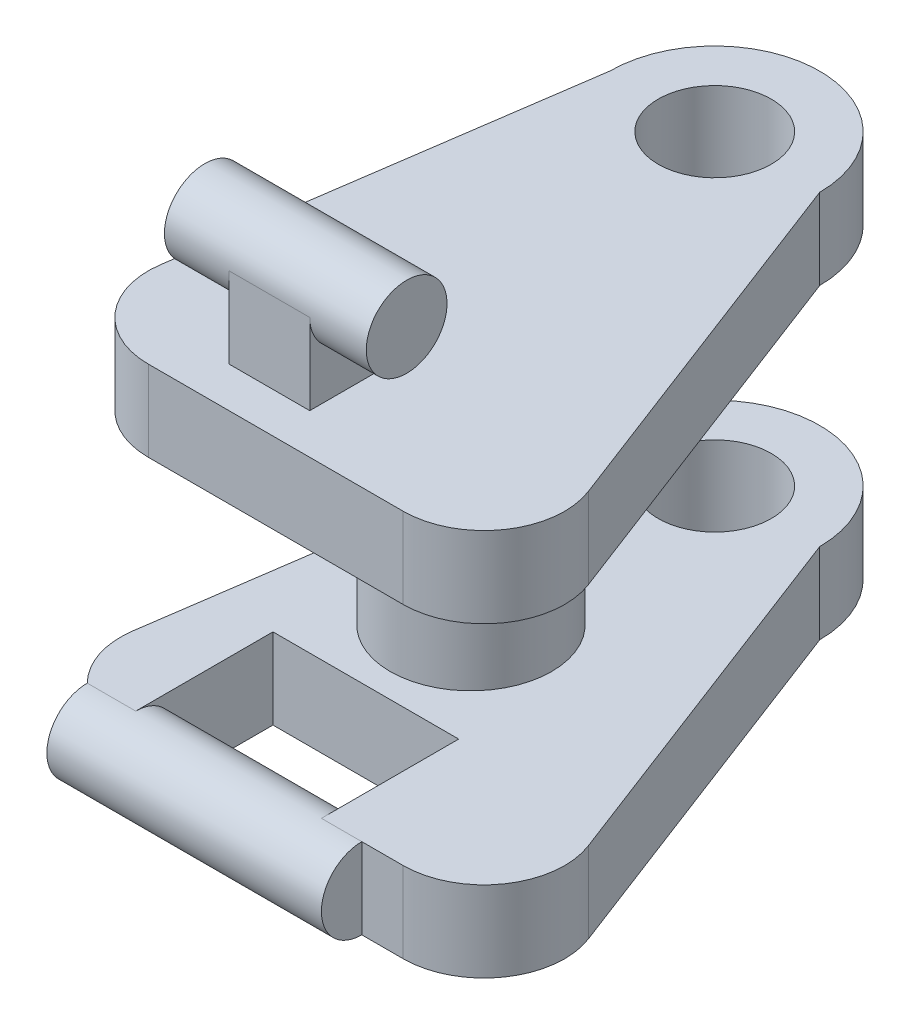
ISO-10303-21;
HEADER;
FILE_DESCRIPTION(('STEP AP214'),'2;1');
FILE_NAME('part.step','',(''),(''),'','','');
FILE_SCHEMA(('AUTOMOTIVE_DESIGN { 1 0 10303 214 1 1 1 1 }'));
ENDSEC;
DATA;
#1=APPLICATION_CONTEXT('core data for automotive mechanical design processes');
#2=APPLICATION_PROTOCOL_DEFINITION('international standard','automotive_design',2000,#1);
#3=PRODUCT_CONTEXT('',#1,'mechanical');
#4=PRODUCT('Part','Part','',(#3));
#5=PRODUCT_RELATED_PRODUCT_CATEGORY('part','',(#4));
#6=PRODUCT_DEFINITION_FORMATION('','',#4);
#7=PRODUCT_DEFINITION_CONTEXT('part definition',#1,'design');
#8=PRODUCT_DEFINITION('design','',#6,#7);
#9=PRODUCT_DEFINITION_SHAPE('','',#8);
#10=(LENGTH_UNIT() NAMED_UNIT(*) SI_UNIT(.MILLI.,.METRE.));
#11=(NAMED_UNIT(*) PLANE_ANGLE_UNIT() SI_UNIT($,.RADIAN.));
#12=(NAMED_UNIT(*) SI_UNIT($,.STERADIAN.) SOLID_ANGLE_UNIT());
#13=UNCERTAINTY_MEASURE_WITH_UNIT(LENGTH_MEASURE(1.E-05),#10,'distance_accuracy_value','');
#14=(GEOMETRIC_REPRESENTATION_CONTEXT(3) GLOBAL_UNCERTAINTY_ASSIGNED_CONTEXT((#13)) GLOBAL_UNIT_ASSIGNED_CONTEXT((#10,
#11,#12)) REPRESENTATION_CONTEXT('',''));
#15=CARTESIAN_POINT('',(0.,0.,0.));
#16=DIRECTION('',(0.,0.,1.));
#17=DIRECTION('',(1.,0.,0.));
#18=AXIS2_PLACEMENT_3D('',#15,#16,#17);
#19=CARTESIAN_POINT('',(0.,10.,0.));
#20=DIRECTION('',(0.,1.,0.));
#21=DIRECTION('',(0.,0.,1.));
#22=AXIS2_PLACEMENT_3D('',#19,#20,#21);
#23=PLANE('',#22);
#24=DIRECTION('',(1.,0.,0.));
#25=VECTOR('',#24,1.);
#26=CARTESIAN_POINT('',(0.,10.,0.));
#27=LINE('',#26,#25);
#28=CARTESIAN_POINT('',(6.09364936911274,10.,0.));
#29=VERTEX_POINT('',#28);
#30=CARTESIAN_POINT('',(37.6709794983246,10.,0.));
#31=VERTEX_POINT('',#30);
#32=EDGE_CURVE('E317',#29,#31,#27,.T.);
#33=ORIENTED_EDGE('',*,*,#32,.T.);
#34=CARTESIAN_POINT('',(37.6709794983246,10.,-10.));
#35=DIRECTION('',(0.,1.,0.));
#36=DIRECTION('',(0.,0.,1.));
#37=AXIS2_PLACEMENT_3D('',#34,#35,#36);
#38=CIRCLE('',#37,10.);
#39=CARTESIAN_POINT('',(47.0107100608177,10.,-13.5734343452809));
#40=VERTEX_POINT('',#39);
#41=EDGE_CURVE('E357',#31,#40,#38,.T.);
#42=ORIENTED_EDGE('',*,*,#41,.T.);
#43=DIRECTION('',(0.357343434528091,0.,0.933973056249305));
#44=VECTOR('',#43,1.);
#45=CARTESIAN_POINT('',(45.5378309625569,10.,-17.4230346456334));
#46=LINE('',#45,#44);
#47=CARTESIAN_POINT('',(29.2476404375621,10.,-60.));
#48=VERTEX_POINT('',#47);
#49=EDGE_CURVE('E308',#48,#40,#46,.T.);
#50=ORIENTED_EDGE('',*,*,#49,.F.);
#51=CARTESIAN_POINT('',(16.2476404375621,10.,-60.));
#52=DIRECTION('',(0.,1.,0.));
#53=DIRECTION('',(0.,0.,1.));
#54=AXIS2_PLACEMENT_3D('',#51,#52,#53);
#55=CIRCLE('',#54,13.);
#56=CARTESIAN_POINT('',(3.24764043756206,10.,-60.));
#57=VERTEX_POINT('',#56);
#58=EDGE_CURVE('E311',#48,#57,#55,.T.);
#59=ORIENTED_EDGE('',*,*,#58,.T.);
#60=DIRECTION('',(-0.143670333869138,0.,0.989625603531927));
#61=VECTOR('',#60,1.);
#62=CARTESIAN_POINT('',(-5.3501850959242,10.,-0.776720889445257));
#63=LINE('',#62,#61);
#64=CARTESIAN_POINT('',(-3.80260666620653,10.,-11.4367033386914));
#65=VERTEX_POINT('',#64);
#66=EDGE_CURVE('E314',#57,#65,#63,.T.);
#67=ORIENTED_EDGE('',*,*,#66,.T.);
#68=CARTESIAN_POINT('',(6.09364936911274,10.,-10.));
#69=DIRECTION('',(0.,1.,0.));
#70=DIRECTION('',(0.,0.,1.));
#71=AXIS2_PLACEMENT_3D('',#68,#69,#70);
#72=CIRCLE('',#71,10.);
#73=EDGE_CURVE('E355',#65,#29,#72,.T.);
#74=ORIENTED_EDGE('',*,*,#73,.T.);
#75=EDGE_LOOP('',(#33,#42,#50,#59,#67,#74));
#76=FACE_BOUND('',#75,.T.);
#77=CARTESIAN_POINT('',(16.2476404375621,10.,-60.));
#78=DIRECTION('',(0.,1.,0.));
#79=DIRECTION('',(0.,0.,1.));
#80=AXIS2_PLACEMENT_3D('',#77,#78,#79);
#81=CIRCLE('',#80,7.);
#82=CARTESIAN_POINT('',(16.2476404375621,10.,-53.));
#83=VERTEX_POINT('',#82);
#84=EDGE_CURVE('E320',#83,#83,#81,.T.);
#85=ORIENTED_EDGE('',*,*,#84,.F.);
#86=EDGE_LOOP('',(#85));
#87=FACE_BOUND('',#86,.T.);
#88=DIRECTION('',(0.,0.,-1.));
#89=VECTOR('',#88,1.);
#90=CARTESIAN_POINT('',(21.0936493691127,10.,0.));
#91=LINE('',#90,#89);
#92=CARTESIAN_POINT('',(21.0936493691127,10.,-5.));
#93=VERTEX_POINT('',#92);
#94=CARTESIAN_POINT('',(21.0936493691127,10.,-15.));
#95=VERTEX_POINT('',#94);
#96=EDGE_CURVE('E50',#93,#95,#91,.T.);
#97=ORIENTED_EDGE('',*,*,#96,.F.);
#98=DIRECTION('',(1.,0.,0.));
#99=VECTOR('',#98,1.);
#100=CARTESIAN_POINT('',(0.,10.,-5.));
#101=LINE('',#100,#99);
#102=CARTESIAN_POINT('',(11.0936493691127,10.,-5.));
#103=VERTEX_POINT('',#102);
#104=EDGE_CURVE('E184',#103,#93,#101,.T.);
#105=ORIENTED_EDGE('',*,*,#104,.F.);
#106=DIRECTION('',(0.,0.,-1.));
#107=VECTOR('',#106,1.);
#108=CARTESIAN_POINT('',(11.0936493691127,10.,0.));
#109=LINE('',#108,#107);
#110=CARTESIAN_POINT('',(11.0936493691127,10.,-15.));
#111=VERTEX_POINT('',#110);
#112=EDGE_CURVE('E199',#103,#111,#109,.T.);
#113=ORIENTED_EDGE('',*,*,#112,.T.);
#114=DIRECTION('',(1.,0.,0.));
#115=VECTOR('',#114,1.);
#116=CARTESIAN_POINT('',(0.,10.,-15.));
#117=LINE('',#116,#115);
#118=EDGE_CURVE('E55',#111,#95,#117,.T.);
#119=ORIENTED_EDGE('',*,*,#118,.T.);
#120=EDGE_LOOP('',(#97,#105,#113,#119));
#121=FACE_BOUND('',#120,.T.);
#122=ADVANCED_FACE('F35',(#76,#87,#121),#23,.T.);
#123=CARTESIAN_POINT('',(16.0525087599727,-28.,-30.));
#124=DIRECTION('',(0.,1.,0.));
#125=DIRECTION('',(0.,0.,1.));
#126=AXIS2_PLACEMENT_3D('',#123,#124,#125);
#127=CYLINDRICAL_SURFACE('',#126,10.);
#128=CARTESIAN_POINT('',(16.0525087599727,0.,-30.));
#129=DIRECTION('',(0.,1.,0.));
#130=DIRECTION('',(0.,0.,1.));
#131=AXIS2_PLACEMENT_3D('',#128,#129,#130);
#132=CIRCLE('',#131,10.);
#133=CARTESIAN_POINT('',(16.0525087599727,0.,-20.));
#134=VERTEX_POINT('',#133);
#135=EDGE_CURVE('E340',#134,#134,#132,.F.);
#136=ORIENTED_EDGE('',*,*,#135,.T.);
#137=EDGE_LOOP('',(#136));
#138=FACE_BOUND('',#137,.T.);
#139=CARTESIAN_POINT('',(16.0525087599727,-28.,-30.));
#140=DIRECTION('',(0.,-1.,0.));
#141=DIRECTION('',(0.,0.,-1.));
#142=AXIS2_PLACEMENT_3D('',#139,#140,#141);
#143=CIRCLE('',#142,10.);
#144=CARTESIAN_POINT('',(16.0525087599727,-28.,-40.));
#145=VERTEX_POINT('',#144);
#146=EDGE_CURVE('E11',#145,#145,#143,.T.);
#147=ORIENTED_EDGE('',*,*,#146,.F.);
#148=EDGE_LOOP('',(#147));
#149=FACE_BOUND('',#148,.T.);
#150=ADVANCED_FACE('F396',(#138,#149),#127,.T.);
#151=CARTESIAN_POINT('',(45.5378309625569,10.,-17.4230346456334));
#152=DIRECTION('',(0.933973056249305,0.,-0.357343434528091));
#153=DIRECTION('',(-0.357343434528091,0.,-0.933973056249305));
#154=AXIS2_PLACEMENT_3D('',#151,#152,#153);
#155=PLANE('',#154);
#156=ORIENTED_EDGE('',*,*,#49,.T.);
#157=DIRECTION('',(0.,-1.,0.));
#158=VECTOR('',#157,1.);
#159=CARTESIAN_POINT('',(47.0107100608177,0.,-13.5734343452809));
#160=LINE('',#159,#158);
#161=CARTESIAN_POINT('',(47.0107100608177,0.,-13.5734343452809));
#162=VERTEX_POINT('',#161);
#163=EDGE_CURVE('E343',#40,#162,#160,.T.);
#164=ORIENTED_EDGE('',*,*,#163,.T.);
#165=DIRECTION('',(0.357343434528091,0.,0.933973056249305));
#166=VECTOR('',#165,1.);
#167=CARTESIAN_POINT('',(45.5378309625569,0.,-17.4230346456334));
#168=LINE('',#167,#166);
#169=CARTESIAN_POINT('',(29.2476404375621,0.,-60.));
#170=VERTEX_POINT('',#169);
#171=EDGE_CURVE('E307',#170,#162,#168,.T.);
#172=ORIENTED_EDGE('',*,*,#171,.F.);
#173=DIRECTION('',(0.,-1.,0.));
#174=VECTOR('',#173,1.);
#175=CARTESIAN_POINT('',(29.2476404375621,10.,-60.));
#176=LINE('',#175,#174);
#177=EDGE_CURVE('E338',#48,#170,#176,.T.);
#178=ORIENTED_EDGE('',*,*,#177,.F.);
#179=EDGE_LOOP('',(#156,#164,#172,#178));
#180=FACE_BOUND('',#179,.T.);
#181=ADVANCED_FACE('F386',(#180),#155,.T.);
#182=CARTESIAN_POINT('',(16.2476404375621,10.,-60.));
#183=DIRECTION('',(0.,-1.,0.));
#184=DIRECTION('',(0.,0.,-1.));
#185=AXIS2_PLACEMENT_3D('',#182,#183,#184);
#186=CYLINDRICAL_SURFACE('',#185,13.);
#187=CARTESIAN_POINT('',(16.2476404375621,0.,-60.));
#188=DIRECTION('',(0.,1.,0.));
#189=DIRECTION('',(0.,0.,1.));
#190=AXIS2_PLACEMENT_3D('',#187,#188,#189);
#191=CIRCLE('',#190,13.);
#192=CARTESIAN_POINT('',(3.24764043756206,0.,-60.));
#193=VERTEX_POINT('',#192);
#194=EDGE_CURVE('E326',#170,#193,#191,.T.);
#195=ORIENTED_EDGE('',*,*,#194,.T.);
#196=DIRECTION('',(0.,-1.,0.));
#197=VECTOR('',#196,1.);
#198=CARTESIAN_POINT('',(3.24764043756206,10.,-60.));
#199=LINE('',#198,#197);
#200=EDGE_CURVE('E323',#57,#193,#199,.T.);
#201=ORIENTED_EDGE('',*,*,#200,.F.);
#202=ORIENTED_EDGE('',*,*,#58,.F.);
#203=ORIENTED_EDGE('',*,*,#177,.T.);
#204=EDGE_LOOP('',(#195,#201,#202,#203));
#205=FACE_BOUND('',#204,.T.);
#206=ADVANCED_FACE('F388',(#205),#186,.T.);
#207=CARTESIAN_POINT('',(-5.3501850959242,10.,-0.776720889445257));
#208=DIRECTION('',(0.989625603531927,0.,0.143670333869138));
#209=DIRECTION('',(0.143670333869138,0.,-0.989625603531927));
#210=AXIS2_PLACEMENT_3D('',#207,#208,#209);
#211=PLANE('',#210);
#212=DIRECTION('',(-0.143670333869138,0.,0.989625603531927));
#213=VECTOR('',#212,1.);
#214=CARTESIAN_POINT('',(-5.3501850959242,0.,-0.776720889445257));
#215=LINE('',#214,#213);
#216=CARTESIAN_POINT('',(-3.80260666620653,0.,-11.4367033386914));
#217=VERTEX_POINT('',#216);
#218=EDGE_CURVE('E328',#193,#217,#215,.T.);
#219=ORIENTED_EDGE('',*,*,#218,.T.);
#220=DIRECTION('',(0.,-1.,0.));
#221=VECTOR('',#220,1.);
#222=CARTESIAN_POINT('',(-3.80260666620653,10.,-11.4367033386914));
#223=LINE('',#222,#221);
#224=EDGE_CURVE('E43',#217,#65,#223,.F.);
#225=ORIENTED_EDGE('',*,*,#224,.T.);
#226=ORIENTED_EDGE('',*,*,#66,.F.);
#227=ORIENTED_EDGE('',*,*,#200,.T.);
#228=EDGE_LOOP('',(#219,#225,#226,#227));
#229=FACE_BOUND('',#228,.T.);
#230=ADVANCED_FACE('F361',(#229),#211,.F.);
#231=CARTESIAN_POINT('',(0.,10.,0.));
#232=DIRECTION('',(0.,0.,-1.));
#233=DIRECTION('',(-1.,0.,0.));
#234=AXIS2_PLACEMENT_3D('',#231,#232,#233);
#235=PLANE('',#234);
#236=DIRECTION('',(1.,0.,0.));
#237=VECTOR('',#236,1.);
#238=CARTESIAN_POINT('',(0.,0.,0.));
#239=LINE('',#238,#237);
#240=CARTESIAN_POINT('',(6.09364936911274,0.,0.));
#241=VERTEX_POINT('',#240);
#242=CARTESIAN_POINT('',(37.6709794983246,0.,0.));
#243=VERTEX_POINT('',#242);
#244=EDGE_CURVE('E331',#241,#243,#239,.T.);
#245=ORIENTED_EDGE('',*,*,#244,.T.);
#246=DIRECTION('',(0.,-1.,0.));
#247=VECTOR('',#246,1.);
#248=CARTESIAN_POINT('',(37.6709794983246,10.,0.));
#249=LINE('',#248,#247);
#250=EDGE_CURVE('E353',#243,#31,#249,.F.);
#251=ORIENTED_EDGE('',*,*,#250,.T.);
#252=ORIENTED_EDGE('',*,*,#32,.F.);
#253=DIRECTION('',(0.,-1.,0.));
#254=VECTOR('',#253,1.);
#255=CARTESIAN_POINT('',(6.09364936911274,10.,0.));
#256=LINE('',#255,#254);
#257=EDGE_CURVE('E350',#29,#241,#256,.T.);
#258=ORIENTED_EDGE('',*,*,#257,.T.);
#259=EDGE_LOOP('',(#245,#251,#252,#258));
#260=FACE_BOUND('',#259,.T.);
#261=ADVANCED_FACE('F374',(#260),#235,.F.);
#262=CARTESIAN_POINT('',(16.2476404375621,10.,-60.));
#263=DIRECTION('',(0.,-1.,0.));
#264=DIRECTION('',(0.,0.,-1.));
#265=AXIS2_PLACEMENT_3D('',#262,#263,#264);
#266=CYLINDRICAL_SURFACE('',#265,7.);
#267=ORIENTED_EDGE('',*,*,#84,.T.);
#268=EDGE_LOOP('',(#267));
#269=FACE_BOUND('',#268,.T.);
#270=CARTESIAN_POINT('',(16.2476404375621,0.,-60.));
#271=DIRECTION('',(0.,1.,0.));
#272=DIRECTION('',(0.,0.,1.));
#273=AXIS2_PLACEMENT_3D('',#270,#271,#272);
#274=CIRCLE('',#273,7.);
#275=CARTESIAN_POINT('',(16.2476404375621,0.,-53.));
#276=VERTEX_POINT('',#275);
#277=EDGE_CURVE('E312',#276,#276,#274,.T.);
#278=ORIENTED_EDGE('',*,*,#277,.F.);
#279=EDGE_LOOP('',(#278));
#280=FACE_BOUND('',#279,.T.);
#281=ADVANCED_FACE('F409',(#269,#280),#266,.F.);
#282=CARTESIAN_POINT('',(0.,0.,0.));
#283=DIRECTION('',(0.,1.,0.));
#284=DIRECTION('',(0.,0.,1.));
#285=AXIS2_PLACEMENT_3D('',#282,#283,#284);
#286=PLANE('',#285);
#287=ORIENTED_EDGE('',*,*,#135,.F.);
#288=EDGE_LOOP('',(#287));
#289=FACE_BOUND('',#288,.T.);
#290=ORIENTED_EDGE('',*,*,#171,.T.);
#291=CARTESIAN_POINT('',(37.6709794983246,0.,-10.));
#292=DIRECTION('',(0.,1.,0.));
#293=DIRECTION('',(0.,0.,1.));
#294=AXIS2_PLACEMENT_3D('',#291,#292,#293);
#295=CIRCLE('',#294,10.);
#296=EDGE_CURVE('E348',#162,#243,#295,.F.);
#297=ORIENTED_EDGE('',*,*,#296,.T.);
#298=ORIENTED_EDGE('',*,*,#244,.F.);
#299=CARTESIAN_POINT('',(6.09364936911274,0.,-10.));
#300=DIRECTION('',(0.,1.,0.));
#301=DIRECTION('',(0.,0.,1.));
#302=AXIS2_PLACEMENT_3D('',#299,#300,#301);
#303=CIRCLE('',#302,10.);
#304=EDGE_CURVE('E346',#241,#217,#303,.F.);
#305=ORIENTED_EDGE('',*,*,#304,.T.);
#306=ORIENTED_EDGE('',*,*,#218,.F.);
#307=ORIENTED_EDGE('',*,*,#194,.F.);
#308=EDGE_LOOP('',(#290,#297,#298,#305,#306,#307));
#309=FACE_BOUND('',#308,.T.);
#310=ORIENTED_EDGE('',*,*,#277,.T.);
#311=EDGE_LOOP('',(#310));
#312=FACE_BOUND('',#311,.T.);
#313=ADVANCED_FACE('F377',(#289,#309,#312),#286,.F.);
#314=CARTESIAN_POINT('',(37.6709794983246,10.,-10.));
#315=DIRECTION('',(0.,1.,0.));
#316=DIRECTION('',(0.,0.,1.));
#317=AXIS2_PLACEMENT_3D('',#314,#315,#316);
#318=CYLINDRICAL_SURFACE('',#317,10.);
#319=ORIENTED_EDGE('',*,*,#41,.F.);
#320=ORIENTED_EDGE('',*,*,#250,.F.);
#321=ORIENTED_EDGE('',*,*,#296,.F.);
#322=ORIENTED_EDGE('',*,*,#163,.F.);
#323=EDGE_LOOP('',(#319,#320,#321,#322));
#324=FACE_BOUND('',#323,.T.);
#325=ADVANCED_FACE('F384',(#324),#318,.T.);
#326=CARTESIAN_POINT('',(6.09364936911274,10.,-10.));
#327=DIRECTION('',(0.,-1.,0.));
#328=DIRECTION('',(0.,0.,-1.));
#329=AXIS2_PLACEMENT_3D('',#326,#327,#328);
#330=CYLINDRICAL_SURFACE('',#329,10.);
#331=ORIENTED_EDGE('',*,*,#73,.F.);
#332=ORIENTED_EDGE('',*,*,#224,.F.);
#333=ORIENTED_EDGE('',*,*,#304,.F.);
#334=ORIENTED_EDGE('',*,*,#257,.F.);
#335=EDGE_LOOP('',(#331,#332,#333,#334));
#336=FACE_BOUND('',#335,.T.);
#337=ADVANCED_FACE('F37',(#336),#330,.T.);
#338=CARTESIAN_POINT('',(0.,-38.,0.));
#339=DIRECTION('',(0.,0.,1.));
#340=DIRECTION('',(1.,0.,0.));
#341=AXIS2_PLACEMENT_3D('',#338,#339,#340);
#342=PLANE('',#341);
#343=DIRECTION('',(1.,0.,0.));
#344=VECTOR('',#343,1.);
#345=CARTESIAN_POINT('',(0.,-38.,0.));
#346=LINE('',#345,#344);
#347=CARTESIAN_POINT('',(32.5370533211989,-38.,0.));
#348=VERTEX_POINT('',#347);
#349=CARTESIAN_POINT('',(37.6709794983246,-38.,0.));
#350=VERTEX_POINT('',#349);
#351=EDGE_CURVE('E263',#348,#350,#346,.T.);
#352=ORIENTED_EDGE('',*,*,#351,.T.);
#353=DIRECTION('',(0.,1.,0.));
#354=VECTOR('',#353,1.);
#355=CARTESIAN_POINT('',(37.6709794983246,-38.,0.));
#356=LINE('',#355,#354);
#357=CARTESIAN_POINT('',(37.6709794983246,-28.,0.));
#358=VERTEX_POINT('',#357);
#359=EDGE_CURVE('E291',#350,#358,#356,.T.);
#360=ORIENTED_EDGE('',*,*,#359,.T.);
#361=DIRECTION('',(1.,0.,0.));
#362=VECTOR('',#361,1.);
#363=CARTESIAN_POINT('',(0.,-28.,0.));
#364=LINE('',#363,#362);
#365=CARTESIAN_POINT('',(32.5370533211989,-28.,0.));
#366=VERTEX_POINT('',#365);
#367=EDGE_CURVE('E278',#366,#358,#364,.T.);
#368=ORIENTED_EDGE('',*,*,#367,.F.);
#369=DIRECTION('',(0.,-1.,0.));
#370=VECTOR('',#369,1.);
#371=CARTESIAN_POINT('',(32.5370533211989,-38.,0.));
#372=LINE('',#371,#370);
#373=EDGE_CURVE('E230',#366,#348,#372,.T.);
#374=ORIENTED_EDGE('',*,*,#373,.T.);
#375=EDGE_LOOP('',(#352,#360,#368,#374));
#376=FACE_BOUND('',#375,.T.);
#377=ADVANCED_FACE('F439',(#376),#342,.T.);
#378=CARTESIAN_POINT('',(0.,-28.,0.));
#379=DIRECTION('',(0.,-1.,0.));
#380=DIRECTION('',(0.,0.,-1.));
#381=AXIS2_PLACEMENT_3D('',#378,#379,#380);
#382=PLANE('',#381);
#383=CARTESIAN_POINT('',(16.2476404375621,-28.,-60.));
#384=DIRECTION('',(0.,-1.,0.));
#385=DIRECTION('',(0.,0.,-1.));
#386=AXIS2_PLACEMENT_3D('',#383,#384,#385);
#387=CIRCLE('',#386,7.);
#388=CARTESIAN_POINT('',(16.2476404375621,-28.,-67.));
#389=VERTEX_POINT('',#388);
#390=EDGE_CURVE('E258',#389,#389,#387,.T.);
#391=ORIENTED_EDGE('',*,*,#390,.T.);
#392=EDGE_LOOP('',(#391));
#393=FACE_BOUND('',#392,.T.);
#394=ORIENTED_EDGE('',*,*,#146,.T.);
#395=EDGE_LOOP('',(#394));
#396=FACE_BOUND('',#395,.T.);
#397=ORIENTED_EDGE('',*,*,#367,.T.);
#398=CARTESIAN_POINT('',(37.6709794983246,-28.,-10.));
#399=DIRECTION('',(0.,-1.,0.));
#400=DIRECTION('',(0.,0.,-1.));
#401=AXIS2_PLACEMENT_3D('',#398,#399,#400);
#402=CIRCLE('',#401,10.);
#403=CARTESIAN_POINT('',(47.0107100608177,-28.,-13.5734343452809));
#404=VERTEX_POINT('',#403);
#405=EDGE_CURVE('E296',#358,#404,#402,.F.);
#406=ORIENTED_EDGE('',*,*,#405,.T.);
#407=DIRECTION('',(-0.357343434528091,0.,-0.933973056249305));
#408=VECTOR('',#407,1.);
#409=CARTESIAN_POINT('',(45.5378309625569,-28.,-17.4230346456334));
#410=LINE('',#409,#408);
#411=CARTESIAN_POINT('',(29.2476404375621,-28.,-60.));
#412=VERTEX_POINT('',#411);
#413=EDGE_CURVE('E276',#404,#412,#410,.T.);
#414=ORIENTED_EDGE('',*,*,#413,.T.);
#415=CARTESIAN_POINT('',(16.2476404375621,-28.,-60.));
#416=DIRECTION('',(0.,-1.,0.));
#417=DIRECTION('',(0.,0.,-1.));
#418=AXIS2_PLACEMENT_3D('',#415,#416,#417);
#419=CIRCLE('',#418,13.);
#420=CARTESIAN_POINT('',(3.24764043756206,-28.,-60.));
#421=VERTEX_POINT('',#420);
#422=EDGE_CURVE('E273',#421,#412,#419,.T.);
#423=ORIENTED_EDGE('',*,*,#422,.F.);
#424=DIRECTION('',(-0.143670333869138,0.,0.989625603531927));
#425=VECTOR('',#424,1.);
#426=CARTESIAN_POINT('',(-5.3501850959242,-28.,-0.776720889445257));
#427=LINE('',#426,#425);
#428=CARTESIAN_POINT('',(-4.23551508302735,-28.,-8.45475681060314));
#429=VERTEX_POINT('',#428);
#430=EDGE_CURVE('E246',#421,#429,#427,.T.);
#431=ORIENTED_EDGE('',*,*,#430,.T.);
#432=CARTESIAN_POINT('',(5.66074095229192,-28.,-7.01805347191176));
#433=DIRECTION('',(0.,-1.,0.));
#434=DIRECTION('',(0.,0.,-1.));
#435=AXIS2_PLACEMENT_3D('',#432,#433,#434);
#436=CIRCLE('',#435,10.);
#437=CARTESIAN_POINT('',(-1.46294667880108,-28.,0.));
#438=VERTEX_POINT('',#437);
#439=EDGE_CURVE('E294',#429,#438,#436,.F.);
#440=ORIENTED_EDGE('',*,*,#439,.T.);
#441=DIRECTION('',(-1.,0.,0.));
#442=VECTOR('',#441,1.);
#443=CARTESIAN_POINT('',(32.5370533211989,-28.,0.));
#444=LINE('',#443,#442);
#445=CARTESIAN_POINT('',(4.53705332119893,-28.,0.));
#446=VERTEX_POINT('',#445);
#447=EDGE_CURVE('E219',#446,#438,#444,.T.);
#448=ORIENTED_EDGE('',*,*,#447,.F.);
#449=DIRECTION('',(0.,0.,1.));
#450=VECTOR('',#449,1.);
#451=CARTESIAN_POINT('',(4.53705332119893,-28.,-17.));
#452=LINE('',#451,#450);
#453=CARTESIAN_POINT('',(4.53705332119893,-28.,-17.));
#454=VERTEX_POINT('',#453);
#455=EDGE_CURVE('E250',#454,#446,#452,.T.);
#456=ORIENTED_EDGE('',*,*,#455,.F.);
#457=DIRECTION('',(-1.,0.,0.));
#458=VECTOR('',#457,1.);
#459=CARTESIAN_POINT('',(0.,-28.,-17.));
#460=LINE('',#459,#458);
#461=CARTESIAN_POINT('',(27.5370533211989,-28.,-17.));
#462=VERTEX_POINT('',#461);
#463=EDGE_CURVE('E234',#462,#454,#460,.T.);
#464=ORIENTED_EDGE('',*,*,#463,.F.);
#465=DIRECTION('',(0.,0.,1.));
#466=VECTOR('',#465,1.);
#467=CARTESIAN_POINT('',(27.5370533211989,-28.,-17.));
#468=LINE('',#467,#466);
#469=CARTESIAN_POINT('',(27.5370533211989,-28.,0.));
#470=VERTEX_POINT('',#469);
#471=EDGE_CURVE('E242',#462,#470,#468,.T.);
#472=ORIENTED_EDGE('',*,*,#471,.T.);
#473=EDGE_CURVE('E281',#470,#366,#364,.T.);
#474=ORIENTED_EDGE('',*,*,#473,.T.);
#475=EDGE_LOOP('',(#397,#406,#414,#423,#431,#440,#448,#456,#464,#472,#474));
#476=FACE_BOUND('',#475,.T.);
#477=ADVANCED_FACE('F446',(#393,#396,#476),#382,.F.);
#478=CARTESIAN_POINT('',(-5.3501850959242,-38.,-0.776720889445257));
#479=DIRECTION('',(-0.989625603531927,0.,-0.143670333869138));
#480=DIRECTION('',(-0.143670333869138,0.,0.989625603531927));
#481=AXIS2_PLACEMENT_3D('',#478,#479,#480);
#482=PLANE('',#481);
#483=DIRECTION('',(-0.143670333869138,0.,0.989625603531927));
#484=VECTOR('',#483,1.);
#485=CARTESIAN_POINT('',(-5.3501850959242,-38.,-0.776720889445257));
#486=LINE('',#485,#484);
#487=CARTESIAN_POINT('',(3.24764043756206,-38.,-60.));
#488=VERTEX_POINT('',#487);
#489=CARTESIAN_POINT('',(-4.23551508302735,-38.,-8.45475681060314));
#490=VERTEX_POINT('',#489);
#491=EDGE_CURVE('E254',#488,#490,#486,.T.);
#492=ORIENTED_EDGE('',*,*,#491,.T.);
#493=DIRECTION('',(0.,1.,0.));
#494=VECTOR('',#493,1.);
#495=CARTESIAN_POINT('',(-4.23551508302735,-28.,-8.45475681060314));
#496=LINE('',#495,#494);
#497=EDGE_CURVE('E304',#490,#429,#496,.T.);
#498=ORIENTED_EDGE('',*,*,#497,.T.);
#499=ORIENTED_EDGE('',*,*,#430,.F.);
#500=DIRECTION('',(0.,1.,0.));
#501=VECTOR('',#500,1.);
#502=CARTESIAN_POINT('',(3.24764043756206,-38.,-60.));
#503=LINE('',#502,#501);
#504=EDGE_CURVE('E286',#488,#421,#503,.T.);
#505=ORIENTED_EDGE('',*,*,#504,.F.);
#506=EDGE_LOOP('',(#492,#498,#499,#505));
#507=FACE_BOUND('',#506,.T.);
#508=ADVANCED_FACE('F454',(#507),#482,.T.);
#509=CARTESIAN_POINT('',(16.2476404375621,-38.,-60.));
#510=DIRECTION('',(0.,1.,0.));
#511=DIRECTION('',(0.,0.,1.));
#512=AXIS2_PLACEMENT_3D('',#509,#510,#511);
#513=CYLINDRICAL_SURFACE('',#512,13.);
#514=ORIENTED_EDGE('',*,*,#422,.T.);
#515=DIRECTION('',(0.,1.,0.));
#516=VECTOR('',#515,1.);
#517=CARTESIAN_POINT('',(29.2476404375621,-38.,-60.));
#518=LINE('',#517,#516);
#519=CARTESIAN_POINT('',(29.2476404375621,-38.,-60.));
#520=VERTEX_POINT('',#519);
#521=EDGE_CURVE('E270',#520,#412,#518,.T.);
#522=ORIENTED_EDGE('',*,*,#521,.F.);
#523=CARTESIAN_POINT('',(16.2476404375621,-38.,-60.));
#524=DIRECTION('',(0.,-1.,0.));
#525=DIRECTION('',(0.,0.,-1.));
#526=AXIS2_PLACEMENT_3D('',#523,#524,#525);
#527=CIRCLE('',#526,13.);
#528=EDGE_CURVE('E257',#488,#520,#527,.T.);
#529=ORIENTED_EDGE('',*,*,#528,.F.);
#530=ORIENTED_EDGE('',*,*,#504,.T.);
#531=EDGE_LOOP('',(#514,#522,#529,#530));
#532=FACE_BOUND('',#531,.T.);
#533=ADVANCED_FACE('F462',(#532),#513,.T.);
#534=CARTESIAN_POINT('',(45.5378309625569,-38.,-17.4230346456334));
#535=DIRECTION('',(0.933973056249305,0.,-0.357343434528091));
#536=DIRECTION('',(-0.357343434528091,0.,-0.933973056249305));
#537=AXIS2_PLACEMENT_3D('',#534,#535,#536);
#538=PLANE('',#537);
#539=ORIENTED_EDGE('',*,*,#413,.F.);
#540=DIRECTION('',(0.,1.,0.));
#541=VECTOR('',#540,1.);
#542=CARTESIAN_POINT('',(47.0107100608177,-38.,-13.5734343452809));
#543=LINE('',#542,#541);
#544=CARTESIAN_POINT('',(47.0107100608177,-38.,-13.5734343452809));
#545=VERTEX_POINT('',#544);
#546=EDGE_CURVE('E298',#404,#545,#543,.F.);
#547=ORIENTED_EDGE('',*,*,#546,.T.);
#548=DIRECTION('',(-0.357343434528091,0.,-0.933973056249305));
#549=VECTOR('',#548,1.);
#550=CARTESIAN_POINT('',(45.5378309625569,-38.,-17.4230346456334));
#551=LINE('',#550,#549);
#552=EDGE_CURVE('E261',#545,#520,#551,.T.);
#553=ORIENTED_EDGE('',*,*,#552,.T.);
#554=ORIENTED_EDGE('',*,*,#521,.T.);
#555=EDGE_LOOP('',(#539,#547,#553,#554));
#556=FACE_BOUND('',#555,.T.);
#557=ADVANCED_FACE('F470',(#556),#538,.T.);
#558=CARTESIAN_POINT('',(16.2476404375621,-38.,-60.));
#559=DIRECTION('',(0.,1.,0.));
#560=DIRECTION('',(0.,0.,1.));
#561=AXIS2_PLACEMENT_3D('',#558,#559,#560);
#562=CYLINDRICAL_SURFACE('',#561,7.);
#563=CARTESIAN_POINT('',(16.2476404375621,-38.,-60.));
#564=DIRECTION('',(0.,-1.,0.));
#565=DIRECTION('',(0.,0.,-1.));
#566=AXIS2_PLACEMENT_3D('',#563,#564,#565);
#567=CIRCLE('',#566,7.);
#568=CARTESIAN_POINT('',(16.2476404375621,-38.,-67.));
#569=VERTEX_POINT('',#568);
#570=EDGE_CURVE('E267',#569,#569,#567,.T.);
#571=ORIENTED_EDGE('',*,*,#570,.T.);
#572=EDGE_LOOP('',(#571));
#573=FACE_BOUND('',#572,.T.);
#574=ORIENTED_EDGE('',*,*,#390,.F.);
#575=EDGE_LOOP('',(#574));
#576=FACE_BOUND('',#575,.T.);
#577=ADVANCED_FACE('F478',(#573,#576),#562,.F.);
#578=CARTESIAN_POINT('',(27.5370533211989,0.,-17.));
#579=DIRECTION('',(-1.,0.,0.));
#580=DIRECTION('',(0.,-1.,0.));
#581=AXIS2_PLACEMENT_3D('',#578,#579,#580);
#582=PLANE('',#581);
#583=CARTESIAN_POINT('',(27.5370533211989,-33.,0.));
#584=DIRECTION('',(-1.,0.,0.));
#585=DIRECTION('',(0.,-1.,0.));
#586=AXIS2_PLACEMENT_3D('',#583,#584,#585);
#587=CIRCLE('',#586,5.);
#588=CARTESIAN_POINT('',(27.5370533211989,-38.,0.));
#589=VERTEX_POINT('',#588);
#590=EDGE_CURVE('E224',#470,#589,#587,.T.);
#591=ORIENTED_EDGE('',*,*,#590,.F.);
#592=ORIENTED_EDGE('',*,*,#471,.F.);
#593=DIRECTION('',(0.,-1.,0.));
#594=VECTOR('',#593,1.);
#595=CARTESIAN_POINT('',(27.5370533211989,0.,-17.));
#596=LINE('',#595,#594);
#597=CARTESIAN_POINT('',(27.5370533211989,-38.,-17.));
#598=VERTEX_POINT('',#597);
#599=EDGE_CURVE('E232',#462,#598,#596,.T.);
#600=ORIENTED_EDGE('',*,*,#599,.T.);
#601=DIRECTION('',(0.,0.,1.));
#602=VECTOR('',#601,1.);
#603=CARTESIAN_POINT('',(27.5370533211989,-38.,-17.));
#604=LINE('',#603,#602);
#605=EDGE_CURVE('E243',#598,#589,#604,.T.);
#606=ORIENTED_EDGE('',*,*,#605,.T.);
#607=EDGE_LOOP('',(#591,#592,#600,#606));
#608=FACE_BOUND('',#607,.T.);
#609=ADVANCED_FACE('F486',(#608),#582,.T.);
#610=CARTESIAN_POINT('',(4.53705332119893,0.,-17.));
#611=DIRECTION('',(1.,0.,0.));
#612=DIRECTION('',(0.,1.,0.));
#613=AXIS2_PLACEMENT_3D('',#610,#611,#612);
#614=PLANE('',#613);
#615=CARTESIAN_POINT('',(4.53705332119893,-33.,0.));
#616=DIRECTION('',(1.,0.,0.));
#617=DIRECTION('',(0.,1.,0.));
#618=AXIS2_PLACEMENT_3D('',#615,#616,#617);
#619=CIRCLE('',#618,5.);
#620=CARTESIAN_POINT('',(4.53705332119893,-38.,0.));
#621=VERTEX_POINT('',#620);
#622=EDGE_CURVE('E288',#621,#446,#619,.T.);
#623=ORIENTED_EDGE('',*,*,#622,.F.);
#624=DIRECTION('',(0.,0.,1.));
#625=VECTOR('',#624,1.);
#626=CARTESIAN_POINT('',(4.53705332119893,-38.,-17.));
#627=LINE('',#626,#625);
#628=CARTESIAN_POINT('',(4.53705332119893,-38.,-17.));
#629=VERTEX_POINT('',#628);
#630=EDGE_CURVE('E247',#629,#621,#627,.T.);
#631=ORIENTED_EDGE('',*,*,#630,.F.);
#632=DIRECTION('',(0.,1.,0.));
#633=VECTOR('',#632,1.);
#634=CARTESIAN_POINT('',(4.53705332119893,0.,-17.));
#635=LINE('',#634,#633);
#636=EDGE_CURVE('E237',#629,#454,#635,.T.);
#637=ORIENTED_EDGE('',*,*,#636,.T.);
#638=ORIENTED_EDGE('',*,*,#455,.T.);
#639=EDGE_LOOP('',(#623,#631,#637,#638));
#640=FACE_BOUND('',#639,.T.);
#641=ADVANCED_FACE('F494',(#640),#614,.T.);
#642=CARTESIAN_POINT('',(0.,0.,-17.));
#643=DIRECTION('',(0.,0.,1.));
#644=DIRECTION('',(1.,0.,0.));
#645=AXIS2_PLACEMENT_3D('',#642,#643,#644);
#646=PLANE('',#645);
#647=ORIENTED_EDGE('',*,*,#599,.F.);
#648=ORIENTED_EDGE('',*,*,#463,.T.);
#649=ORIENTED_EDGE('',*,*,#636,.F.);
#650=DIRECTION('',(1.,0.,0.));
#651=VECTOR('',#650,1.);
#652=CARTESIAN_POINT('',(0.,-38.,-17.));
#653=LINE('',#652,#651);
#654=EDGE_CURVE('E239',#629,#598,#653,.T.);
#655=ORIENTED_EDGE('',*,*,#654,.T.);
#656=EDGE_LOOP('',(#647,#648,#649,#655));
#657=FACE_BOUND('',#656,.T.);
#658=ADVANCED_FACE('F502',(#657),#646,.T.);
#659=CARTESIAN_POINT('',(32.5370533211989,-33.,0.));
#660=DIRECTION('',(-1.,0.,0.));
#661=DIRECTION('',(0.,-1.,0.));
#662=AXIS2_PLACEMENT_3D('',#659,#660,#661);
#663=CYLINDRICAL_SURFACE('',#662,5.);
#664=DIRECTION('',(-1.,0.,0.));
#665=VECTOR('',#664,1.);
#666=CARTESIAN_POINT('',(32.5370533211989,-38.,0.));
#667=LINE('',#666,#665);
#668=CARTESIAN_POINT('',(-1.46294667880107,-38.,0.));
#669=VERTEX_POINT('',#668);
#670=EDGE_CURVE('E222',#621,#669,#667,.T.);
#671=ORIENTED_EDGE('',*,*,#670,.F.);
#672=ORIENTED_EDGE('',*,*,#622,.T.);
#673=ORIENTED_EDGE('',*,*,#447,.T.);
#674=CARTESIAN_POINT('',(-1.46294667880107,-33.,0.));
#675=DIRECTION('',(-1.,0.,0.));
#676=DIRECTION('',(0.,-1.,0.));
#677=AXIS2_PLACEMENT_3D('',#674,#675,#676);
#678=CIRCLE('',#677,5.);
#679=EDGE_CURVE('E186',#669,#438,#678,.T.);
#680=ORIENTED_EDGE('',*,*,#679,.F.);
#681=EDGE_LOOP('',(#671,#672,#673,#680));
#682=FACE_BOUND('',#681,.T.);
#683=EDGE_CURVE('E266',#589,#348,#346,.T.);
#684=ORIENTED_EDGE('',*,*,#683,.T.);
#685=CARTESIAN_POINT('',(32.5370533211989,-33.,0.));
#686=DIRECTION('',(-1.,0.,0.));
#687=DIRECTION('',(0.,-1.,0.));
#688=AXIS2_PLACEMENT_3D('',#685,#686,#687);
#689=CIRCLE('',#688,5.);
#690=EDGE_CURVE('E216',#348,#366,#689,.T.);
#691=ORIENTED_EDGE('',*,*,#690,.T.);
#692=ORIENTED_EDGE('',*,*,#473,.F.);
#693=ORIENTED_EDGE('',*,*,#590,.T.);
#694=EDGE_LOOP('',(#684,#691,#692,#693));
#695=FACE_BOUND('',#694,.T.);
#696=ADVANCED_FACE('F510',(#682,#695),#663,.T.);
#697=CARTESIAN_POINT('',(32.5370533211989,-33.,0.));
#698=DIRECTION('',(-1.,0.,0.));
#699=DIRECTION('',(0.,-1.,0.));
#700=AXIS2_PLACEMENT_3D('',#697,#698,#699);
#701=PLANE('',#700);
#702=ORIENTED_EDGE('',*,*,#373,.F.);
#703=ORIENTED_EDGE('',*,*,#690,.F.);
#704=EDGE_LOOP('',(#702,#703));
#705=FACE_BOUND('',#704,.T.);
#706=ADVANCED_FACE('F518',(#705),#701,.F.);
#707=CARTESIAN_POINT('',(-1.46294667880107,-33.,0.));
#708=DIRECTION('',(-1.,0.,0.));
#709=DIRECTION('',(0.,-1.,0.));
#710=AXIS2_PLACEMENT_3D('',#707,#708,#709);
#711=PLANE('',#710);
#712=ORIENTED_EDGE('',*,*,#679,.T.);
#713=DIRECTION('',(0.,-1.,0.));
#714=VECTOR('',#713,1.);
#715=CARTESIAN_POINT('',(-1.46294667880107,-38.,0.));
#716=LINE('',#715,#714);
#717=EDGE_CURVE('E227',#438,#669,#716,.T.);
#718=ORIENTED_EDGE('',*,*,#717,.T.);
#719=EDGE_LOOP('',(#712,#718));
#720=FACE_BOUND('',#719,.T.);
#721=ADVANCED_FACE('F526',(#720),#711,.T.);
#722=CARTESIAN_POINT('',(37.6709794983246,-38.,-10.));
#723=DIRECTION('',(0.,1.,0.));
#724=DIRECTION('',(0.,0.,1.));
#725=AXIS2_PLACEMENT_3D('',#722,#723,#724);
#726=CYLINDRICAL_SURFACE('',#725,10.);
#727=CARTESIAN_POINT('',(37.6709794983246,-38.,-10.));
#728=DIRECTION('',(0.,-1.,0.));
#729=DIRECTION('',(0.,0.,-1.));
#730=AXIS2_PLACEMENT_3D('',#727,#728,#729);
#731=CIRCLE('',#730,10.);
#732=EDGE_CURVE('E302',#545,#350,#731,.T.);
#733=ORIENTED_EDGE('',*,*,#732,.F.);
#734=ORIENTED_EDGE('',*,*,#546,.F.);
#735=ORIENTED_EDGE('',*,*,#405,.F.);
#736=ORIENTED_EDGE('',*,*,#359,.F.);
#737=EDGE_LOOP('',(#733,#734,#735,#736));
#738=FACE_BOUND('',#737,.T.);
#739=ADVANCED_FACE('F534',(#738),#726,.T.);
#740=CARTESIAN_POINT('',(5.66074095229192,-38.,-7.01805347191176));
#741=DIRECTION('',(0.,-1.,0.));
#742=DIRECTION('',(1.,0.,0.));
#743=AXIS2_PLACEMENT_3D('',#740,#741,#742);
#744=CYLINDRICAL_SURFACE('',#743,10.);
#745=CARTESIAN_POINT('',(5.66074095229192,-38.,-7.01805347191176));
#746=DIRECTION('',(0.,-1.,0.));
#747=DIRECTION('',(0.,0.,-1.));
#748=AXIS2_PLACEMENT_3D('',#745,#746,#747);
#749=CIRCLE('',#748,10.);
#750=EDGE_CURVE('E300',#669,#490,#749,.T.);
#751=ORIENTED_EDGE('',*,*,#750,.F.);
#752=ORIENTED_EDGE('',*,*,#717,.F.);
#753=ORIENTED_EDGE('',*,*,#439,.F.);
#754=ORIENTED_EDGE('',*,*,#497,.F.);
#755=EDGE_LOOP('',(#751,#752,#753,#754));
#756=FACE_BOUND('',#755,.T.);
#757=ADVANCED_FACE('F542',(#756),#744,.T.);
#758=CARTESIAN_POINT('',(16.0525087599727,-38.,-30.));
#759=DIRECTION('',(0.,-1.,0.));
#760=DIRECTION('',(0.,0.,-1.));
#761=AXIS2_PLACEMENT_3D('',#758,#759,#760);
#762=PLANE('',#761);
#763=ORIENTED_EDGE('',*,*,#570,.F.);
#764=EDGE_LOOP('',(#763));
#765=FACE_BOUND('',#764,.T.);
#766=ORIENTED_EDGE('',*,*,#552,.F.);
#767=ORIENTED_EDGE('',*,*,#732,.T.);
#768=ORIENTED_EDGE('',*,*,#351,.F.);
#769=ORIENTED_EDGE('',*,*,#683,.F.);
#770=ORIENTED_EDGE('',*,*,#605,.F.);
#771=ORIENTED_EDGE('',*,*,#654,.F.);
#772=ORIENTED_EDGE('',*,*,#630,.T.);
#773=ORIENTED_EDGE('',*,*,#670,.T.);
#774=ORIENTED_EDGE('',*,*,#750,.T.);
#775=ORIENTED_EDGE('',*,*,#491,.F.);
#776=ORIENTED_EDGE('',*,*,#528,.T.);
#777=EDGE_LOOP('',(#766,#767,#768,#769,#770,#771,#772,#773,#774,#775,#776));
#778=FACE_BOUND('',#777,.T.);
#779=ADVANCED_FACE('F550',(#765,#778),#762,.T.);
#780=CARTESIAN_POINT('',(0.,20.,-5.));
#781=DIRECTION('',(0.,0.,-1.));
#782=DIRECTION('',(-1.,0.,0.));
#783=AXIS2_PLACEMENT_3D('',#780,#781,#782);
#784=PLANE('',#783);
#785=ORIENTED_EDGE('',*,*,#104,.T.);
#786=DIRECTION('',(0.,-1.,0.));
#787=VECTOR('',#786,1.);
#788=CARTESIAN_POINT('',(21.0936493691127,20.,-5.));
#789=LINE('',#788,#787);
#790=CARTESIAN_POINT('',(21.0936493691127,20.,-5.));
#791=VERTEX_POINT('',#790);
#792=EDGE_CURVE('E177',#791,#93,#789,.T.);
#793=ORIENTED_EDGE('',*,*,#792,.F.);
#794=DIRECTION('',(1.,0.,0.));
#795=VECTOR('',#794,1.);
#796=CARTESIAN_POINT('',(0.,20.,-5.));
#797=LINE('',#796,#795);
#798=CARTESIAN_POINT('',(11.0936493691127,20.,-5.));
#799=VERTEX_POINT('',#798);
#800=EDGE_CURVE('E182',#799,#791,#797,.T.);
#801=ORIENTED_EDGE('',*,*,#800,.F.);
#802=DIRECTION('',(0.,-1.,0.));
#803=VECTOR('',#802,1.);
#804=CARTESIAN_POINT('',(11.0936493691127,20.,-5.));
#805=LINE('',#804,#803);
#806=EDGE_CURVE('E201',#799,#103,#805,.T.);
#807=ORIENTED_EDGE('',*,*,#806,.T.);
#808=EDGE_LOOP('',(#785,#793,#801,#807));
#809=FACE_BOUND('',#808,.T.);
#810=ADVANCED_FACE('F179',(#809),#784,.F.);
#811=CARTESIAN_POINT('',(21.0936493691127,20.,0.));
#812=DIRECTION('',(-1.,0.,0.));
#813=DIRECTION('',(0.,0.,1.));
#814=AXIS2_PLACEMENT_3D('',#811,#812,#813);
#815=PLANE('',#814);
#816=DIRECTION('',(0.,-1.,0.));
#817=VECTOR('',#816,1.);
#818=CARTESIAN_POINT('',(21.0936493691127,20.,-15.));
#819=LINE('',#818,#817);
#820=CARTESIAN_POINT('',(21.0936493691127,20.,-15.));
#821=VERTEX_POINT('',#820);
#822=EDGE_CURVE('E187',#821,#95,#819,.T.);
#823=ORIENTED_EDGE('',*,*,#822,.F.);
#824=CARTESIAN_POINT('',(21.0936493691127,20.,-10.));
#825=DIRECTION('',(-1.,0.,0.));
#826=DIRECTION('',(0.,0.,1.));
#827=AXIS2_PLACEMENT_3D('',#824,#825,#826);
#828=CIRCLE('',#827,5.);
#829=EDGE_CURVE('E190',#821,#791,#828,.T.);
#830=ORIENTED_EDGE('',*,*,#829,.T.);
#831=ORIENTED_EDGE('',*,*,#792,.T.);
#832=ORIENTED_EDGE('',*,*,#96,.T.);
#833=EDGE_LOOP('',(#823,#830,#831,#832));
#834=FACE_BOUND('',#833,.T.);
#835=ADVANCED_FACE('F191',(#834),#815,.F.);
#836=CARTESIAN_POINT('',(0.,20.,-15.));
#837=DIRECTION('',(0.,0.,-1.));
#838=DIRECTION('',(-1.,0.,0.));
#839=AXIS2_PLACEMENT_3D('',#836,#837,#838);
#840=PLANE('',#839);
#841=ORIENTED_EDGE('',*,*,#118,.F.);
#842=DIRECTION('',(0.,-1.,0.));
#843=VECTOR('',#842,1.);
#844=CARTESIAN_POINT('',(11.0936493691127,20.,-15.));
#845=LINE('',#844,#843);
#846=CARTESIAN_POINT('',(11.0936493691127,20.,-15.));
#847=VERTEX_POINT('',#846);
#848=EDGE_CURVE('E210',#847,#111,#845,.T.);
#849=ORIENTED_EDGE('',*,*,#848,.F.);
#850=DIRECTION('',(1.,0.,0.));
#851=VECTOR('',#850,1.);
#852=CARTESIAN_POINT('',(0.,20.,-15.));
#853=LINE('',#852,#851);
#854=EDGE_CURVE('E198',#847,#821,#853,.T.);
#855=ORIENTED_EDGE('',*,*,#854,.T.);
#856=ORIENTED_EDGE('',*,*,#822,.T.);
#857=EDGE_LOOP('',(#841,#849,#855,#856));
#858=FACE_BOUND('',#857,.T.);
#859=ADVANCED_FACE('F570',(#858),#840,.T.);
#860=CARTESIAN_POINT('',(11.0936493691127,20.,0.));
#861=DIRECTION('',(-1.,0.,0.));
#862=DIRECTION('',(0.,0.,1.));
#863=AXIS2_PLACEMENT_3D('',#860,#861,#862);
#864=PLANE('',#863);
#865=CARTESIAN_POINT('',(11.0936493691127,20.,-10.));
#866=DIRECTION('',(-1.,0.,0.));
#867=DIRECTION('',(0.,0.,1.));
#868=AXIS2_PLACEMENT_3D('',#865,#866,#867);
#869=CIRCLE('',#868,5.);
#870=EDGE_CURVE('E195',#847,#799,#869,.T.);
#871=ORIENTED_EDGE('',*,*,#870,.F.);
#872=ORIENTED_EDGE('',*,*,#848,.T.);
#873=ORIENTED_EDGE('',*,*,#112,.F.);
#874=ORIENTED_EDGE('',*,*,#806,.F.);
#875=EDGE_LOOP('',(#871,#872,#873,#874));
#876=FACE_BOUND('',#875,.T.);
#877=ADVANCED_FACE('F577',(#876),#864,.T.);
#878=CARTESIAN_POINT('',(28.0936493691127,20.,-10.));
#879=DIRECTION('',(-1.,0.,0.));
#880=DIRECTION('',(0.,0.,1.));
#881=AXIS2_PLACEMENT_3D('',#878,#879,#880);
#882=CYLINDRICAL_SURFACE('',#881,5.);
#883=CARTESIAN_POINT('',(3.09364936911275,20.,-10.));
#884=DIRECTION('',(-1.,0.,0.));
#885=DIRECTION('',(0.,0.,1.));
#886=AXIS2_PLACEMENT_3D('',#883,#884,#885);
#887=CIRCLE('',#886,5.);
#888=CARTESIAN_POINT('',(3.09364936911275,20.,-5.));
#889=VERTEX_POINT('',#888);
#890=EDGE_CURVE('E707',#889,#889,#887,.T.);
#891=ORIENTED_EDGE('',*,*,#890,.F.);
#892=EDGE_LOOP('',(#891));
#893=FACE_BOUND('',#892,.T.);
#894=CARTESIAN_POINT('',(28.0936493691127,20.,-10.));
#895=DIRECTION('',(-1.,0.,0.));
#896=DIRECTION('',(0.,0.,1.));
#897=AXIS2_PLACEMENT_3D('',#894,#895,#896);
#898=CIRCLE('',#897,5.);
#899=CARTESIAN_POINT('',(28.0936493691127,20.,-5.));
#900=VERTEX_POINT('',#899);
#901=EDGE_CURVE('E708',#900,#900,#898,.T.);
#902=ORIENTED_EDGE('',*,*,#901,.T.);
#903=EDGE_LOOP('',(#902));
#904=FACE_BOUND('',#903,.T.);
#905=ORIENTED_EDGE('',*,*,#829,.F.);
#906=ORIENTED_EDGE('',*,*,#854,.F.);
#907=ORIENTED_EDGE('',*,*,#870,.T.);
#908=ORIENTED_EDGE('',*,*,#800,.T.);
#909=EDGE_LOOP('',(#905,#906,#907,#908));
#910=FACE_BOUND('',#909,.T.);
#911=ADVANCED_FACE('F197',(#893,#904,#910),#882,.T.);
#912=CARTESIAN_POINT('',(28.0936493691127,20.,-10.));
#913=DIRECTION('',(-1.,0.,0.));
#914=DIRECTION('',(0.,0.,1.));
#915=AXIS2_PLACEMENT_3D('',#912,#913,#914);
#916=PLANE('',#915);
#917=ORIENTED_EDGE('',*,*,#901,.F.);
#918=EDGE_LOOP('',(#917));
#919=FACE_BOUND('',#918,.T.);
#920=ADVANCED_FACE('F592',(#919),#916,.F.);
#921=CARTESIAN_POINT('',(3.09364936911275,20.,-10.));
#922=DIRECTION('',(-1.,0.,0.));
#923=DIRECTION('',(0.,0.,1.));
#924=AXIS2_PLACEMENT_3D('',#921,#922,#923);
#925=PLANE('',#924);
#926=ORIENTED_EDGE('',*,*,#890,.T.);
#927=EDGE_LOOP('',(#926));
#928=FACE_BOUND('',#927,.T.);
#929=ADVANCED_FACE('F600',(#928),#925,.T.);
#930=CLOSED_SHELL('',(#122,#150,#181,#206,#230,#261,#281,#313,#325,#337,#377,#477,#508,#533,
#557,#577,#609,#641,#658,#696,#706,#721,#739,#757,#779,#810,#835,#859,#877,#911,#920,#929));
#931=MANIFOLD_SOLID_BREP('B2',#930);
#932=ADVANCED_BREP_SHAPE_REPRESENTATION('',(#18,#931),#14);
#933=SHAPE_DEFINITION_REPRESENTATION(#9,#932);
ENDSEC;
END-ISO-10303-21;
